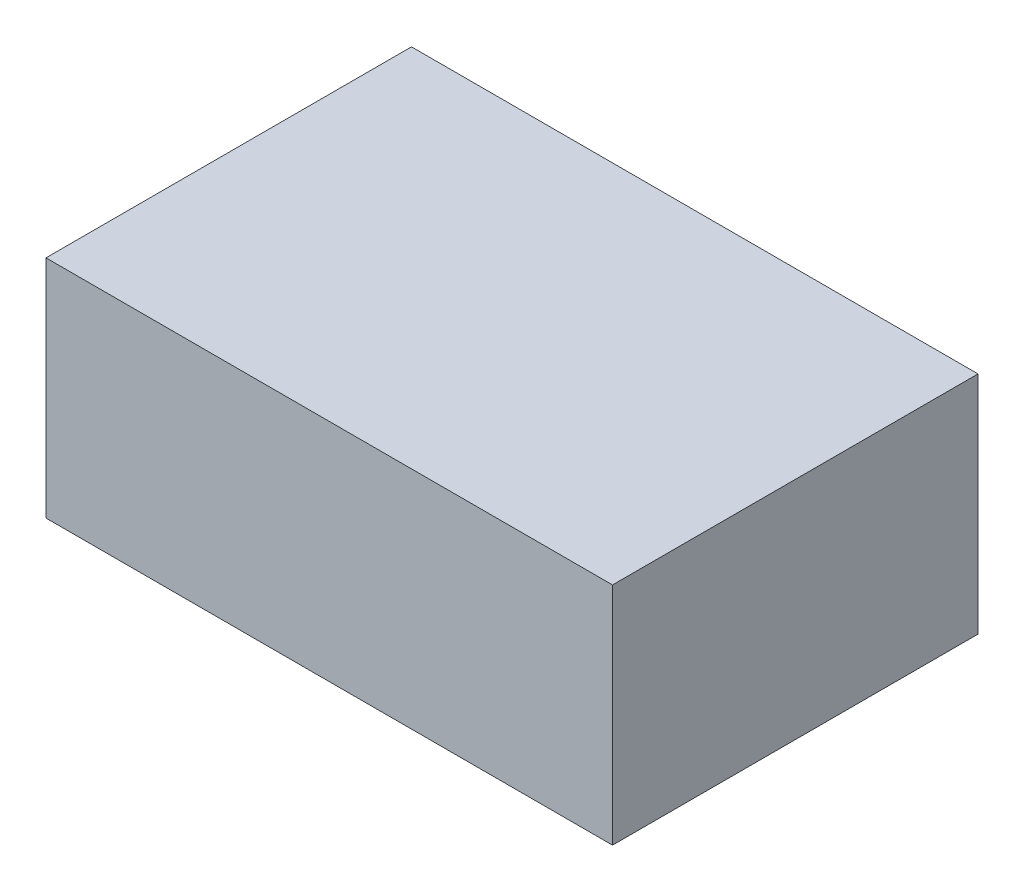
ISO-10303-21;
HEADER;
FILE_DESCRIPTION(('STEP AP214'),'2;1');
FILE_NAME('part.step','',(''),(''),'','','');
FILE_SCHEMA(('AUTOMOTIVE_DESIGN { 1 0 10303 214 1 1 1 1 }'));
ENDSEC;
DATA;
#1=APPLICATION_CONTEXT('core data for automotive mechanical design processes');
#2=APPLICATION_PROTOCOL_DEFINITION('international standard','automotive_design',2000,#1);
#3=PRODUCT_CONTEXT('',#1,'mechanical');
#4=PRODUCT('Part','Part','',(#3));
#5=PRODUCT_RELATED_PRODUCT_CATEGORY('part','',(#4));
#6=PRODUCT_DEFINITION_FORMATION('','',#4);
#7=PRODUCT_DEFINITION_CONTEXT('part definition',#1,'design');
#8=PRODUCT_DEFINITION('design','',#6,#7);
#9=PRODUCT_DEFINITION_SHAPE('','',#8);
#10=(LENGTH_UNIT() NAMED_UNIT(*) SI_UNIT(.MILLI.,.METRE.));
#11=(NAMED_UNIT(*) PLANE_ANGLE_UNIT() SI_UNIT($,.RADIAN.));
#12=(NAMED_UNIT(*) SI_UNIT($,.STERADIAN.) SOLID_ANGLE_UNIT());
#13=UNCERTAINTY_MEASURE_WITH_UNIT(LENGTH_MEASURE(1.E-05),#10,'distance_accuracy_value','');
#14=(GEOMETRIC_REPRESENTATION_CONTEXT(3) GLOBAL_UNCERTAINTY_ASSIGNED_CONTEXT((#13)) GLOBAL_UNIT_ASSIGNED_CONTEXT((#10,
#11,#12)) REPRESENTATION_CONTEXT('',''));
#15=CARTESIAN_POINT('',(0.,0.,0.));
#16=DIRECTION('',(0.,0.,1.));
#17=DIRECTION('',(1.,0.,0.));
#18=AXIS2_PLACEMENT_3D('',#15,#16,#17);
#19=CARTESIAN_POINT('',(-147.6375,117.475,95.25));
#20=DIRECTION('',(1.,0.,0.));
#21=DIRECTION('',(0.,0.,-1.));
#22=AXIS2_PLACEMENT_3D('',#19,#20,#21);
#23=PLANE('',#22);
#24=DIRECTION('',(0.,0.,1.));
#25=VECTOR('',#24,1.);
#26=CARTESIAN_POINT('',(-147.6375,0.,95.25));
#27=LINE('',#26,#25);
#28=CARTESIAN_POINT('',(-147.6375,0.,-95.25));
#29=VERTEX_POINT('',#28);
#30=CARTESIAN_POINT('',(-147.6375,0.,95.25));
#31=VERTEX_POINT('',#30);
#32=EDGE_CURVE('E107',#29,#31,#27,.T.);
#33=ORIENTED_EDGE('',*,*,#32,.T.);
#34=DIRECTION('',(0.,-1.,0.));
#35=VECTOR('',#34,1.);
#36=CARTESIAN_POINT('',(-147.6375,117.475,95.25));
#37=LINE('',#36,#35);
#38=CARTESIAN_POINT('',(-147.6375,117.475,95.25));
#39=VERTEX_POINT('',#38);
#40=EDGE_CURVE('E11',#39,#31,#37,.T.);
#41=ORIENTED_EDGE('',*,*,#40,.F.);
#42=DIRECTION('',(0.,0.,1.));
#43=VECTOR('',#42,1.);
#44=CARTESIAN_POINT('',(-147.6375,117.475,95.25));
#45=LINE('',#44,#43);
#46=CARTESIAN_POINT('',(-147.6375,117.475,-95.25));
#47=VERTEX_POINT('',#46);
#48=EDGE_CURVE('E91',#47,#39,#45,.T.);
#49=ORIENTED_EDGE('',*,*,#48,.F.);
#50=DIRECTION('',(0.,-1.,0.));
#51=VECTOR('',#50,1.);
#52=CARTESIAN_POINT('',(-147.6375,117.475,-95.25));
#53=LINE('',#52,#51);
#54=EDGE_CURVE('E103',#47,#29,#53,.T.);
#55=ORIENTED_EDGE('',*,*,#54,.T.);
#56=EDGE_LOOP('',(#33,#41,#49,#55));
#57=FACE_BOUND('',#56,.T.);
#58=ADVANCED_FACE('F39',(#57),#23,.F.);
#59=CARTESIAN_POINT('',(147.6375,117.475,95.25));
#60=DIRECTION('',(0.,0.,-1.));
#61=DIRECTION('',(-1.,0.,0.));
#62=AXIS2_PLACEMENT_3D('',#59,#60,#61);
#63=PLANE('',#62);
#64=DIRECTION('',(1.,0.,0.));
#65=VECTOR('',#64,1.);
#66=CARTESIAN_POINT('',(147.6375,0.,95.25));
#67=LINE('',#66,#65);
#68=CARTESIAN_POINT('',(147.6375,0.,95.25));
#69=VERTEX_POINT('',#68);
#70=EDGE_CURVE('E96',#31,#69,#67,.T.);
#71=ORIENTED_EDGE('',*,*,#70,.T.);
#72=DIRECTION('',(0.,-1.,0.));
#73=VECTOR('',#72,1.);
#74=CARTESIAN_POINT('',(147.6375,117.475,95.25));
#75=LINE('',#74,#73);
#76=CARTESIAN_POINT('',(147.6375,117.475,95.25));
#77=VERTEX_POINT('',#76);
#78=EDGE_CURVE('E48',#77,#69,#75,.T.);
#79=ORIENTED_EDGE('',*,*,#78,.F.);
#80=DIRECTION('',(1.,0.,0.));
#81=VECTOR('',#80,1.);
#82=CARTESIAN_POINT('',(147.6375,117.475,95.25));
#83=LINE('',#82,#81);
#84=EDGE_CURVE('E86',#39,#77,#83,.T.);
#85=ORIENTED_EDGE('',*,*,#84,.F.);
#86=ORIENTED_EDGE('',*,*,#40,.T.);
#87=EDGE_LOOP('',(#71,#79,#85,#86));
#88=FACE_BOUND('',#87,.T.);
#89=ADVANCED_FACE('F95',(#88),#63,.F.);
#90=CARTESIAN_POINT('',(147.6375,117.475,95.25));
#91=DIRECTION('',(-1.,0.,0.));
#92=DIRECTION('',(0.,0.,1.));
#93=AXIS2_PLACEMENT_3D('',#90,#91,#92);
#94=PLANE('',#93);
#95=DIRECTION('',(0.,0.,-1.));
#96=VECTOR('',#95,1.);
#97=CARTESIAN_POINT('',(147.6375,0.,95.25));
#98=LINE('',#97,#96);
#99=CARTESIAN_POINT('',(147.6375,0.,-95.25));
#100=VERTEX_POINT('',#99);
#101=EDGE_CURVE('E73',#69,#100,#98,.T.);
#102=ORIENTED_EDGE('',*,*,#101,.T.);
#103=DIRECTION('',(0.,-1.,0.));
#104=VECTOR('',#103,1.);
#105=CARTESIAN_POINT('',(147.6375,117.475,-95.25));
#106=LINE('',#105,#104);
#107=CARTESIAN_POINT('',(147.6375,117.475,-95.25));
#108=VERTEX_POINT('',#107);
#109=EDGE_CURVE('E98',#108,#100,#106,.T.);
#110=ORIENTED_EDGE('',*,*,#109,.F.);
#111=DIRECTION('',(0.,0.,-1.));
#112=VECTOR('',#111,1.);
#113=CARTESIAN_POINT('',(147.6375,117.475,95.25));
#114=LINE('',#113,#112);
#115=EDGE_CURVE('E89',#77,#108,#114,.T.);
#116=ORIENTED_EDGE('',*,*,#115,.F.);
#117=ORIENTED_EDGE('',*,*,#78,.T.);
#118=EDGE_LOOP('',(#102,#110,#116,#117));
#119=FACE_BOUND('',#118,.T.);
#120=ADVANCED_FACE('F99',(#119),#94,.F.);
#121=CARTESIAN_POINT('',(147.6375,117.475,-95.25));
#122=DIRECTION('',(0.,0.,1.));
#123=DIRECTION('',(1.,0.,0.));
#124=AXIS2_PLACEMENT_3D('',#121,#122,#123);
#125=PLANE('',#124);
#126=DIRECTION('',(-1.,0.,0.));
#127=VECTOR('',#126,1.);
#128=CARTESIAN_POINT('',(147.6375,0.,-95.25));
#129=LINE('',#128,#127);
#130=EDGE_CURVE('E79',#100,#29,#129,.T.);
#131=ORIENTED_EDGE('',*,*,#130,.T.);
#132=ORIENTED_EDGE('',*,*,#54,.F.);
#133=DIRECTION('',(-1.,0.,0.));
#134=VECTOR('',#133,1.);
#135=CARTESIAN_POINT('',(147.6375,117.475,-95.25));
#136=LINE('',#135,#134);
#137=EDGE_CURVE('E56',#108,#47,#136,.T.);
#138=ORIENTED_EDGE('',*,*,#137,.F.);
#139=ORIENTED_EDGE('',*,*,#109,.T.);
#140=EDGE_LOOP('',(#131,#132,#138,#139));
#141=FACE_BOUND('',#140,.T.);
#142=ADVANCED_FACE('F120',(#141),#125,.F.);
#143=CARTESIAN_POINT('',(0.,117.475,0.));
#144=DIRECTION('',(0.,1.,0.));
#145=DIRECTION('',(0.,0.,1.));
#146=AXIS2_PLACEMENT_3D('',#143,#144,#145);
#147=PLANE('',#146);
#148=ORIENTED_EDGE('',*,*,#48,.T.);
#149=ORIENTED_EDGE('',*,*,#84,.T.);
#150=ORIENTED_EDGE('',*,*,#115,.T.);
#151=ORIENTED_EDGE('',*,*,#137,.T.);
#152=EDGE_LOOP('',(#148,#149,#150,#151));
#153=FACE_BOUND('',#152,.T.);
#154=ADVANCED_FACE('F87',(#153),#147,.T.);
#155=CARTESIAN_POINT('',(0.,0.,0.));
#156=DIRECTION('',(0.,1.,0.));
#157=DIRECTION('',(0.,0.,1.));
#158=AXIS2_PLACEMENT_3D('',#155,#156,#157);
#159=PLANE('',#158);
#160=ORIENTED_EDGE('',*,*,#32,.F.);
#161=ORIENTED_EDGE('',*,*,#130,.F.);
#162=ORIENTED_EDGE('',*,*,#101,.F.);
#163=ORIENTED_EDGE('',*,*,#70,.F.);
#164=EDGE_LOOP('',(#160,#161,#162,#163));
#165=FACE_BOUND('',#164,.T.);
#166=ADVANCED_FACE('F123',(#165),#159,.F.);
#167=CLOSED_SHELL('',(#58,#89,#120,#142,#154,#166));
#168=MANIFOLD_SOLID_BREP('B2',#167);
#169=ADVANCED_BREP_SHAPE_REPRESENTATION('',(#18,#168),#14);
#170=SHAPE_DEFINITION_REPRESENTATION(#9,#169);
ENDSEC;
END-ISO-10303-21;
